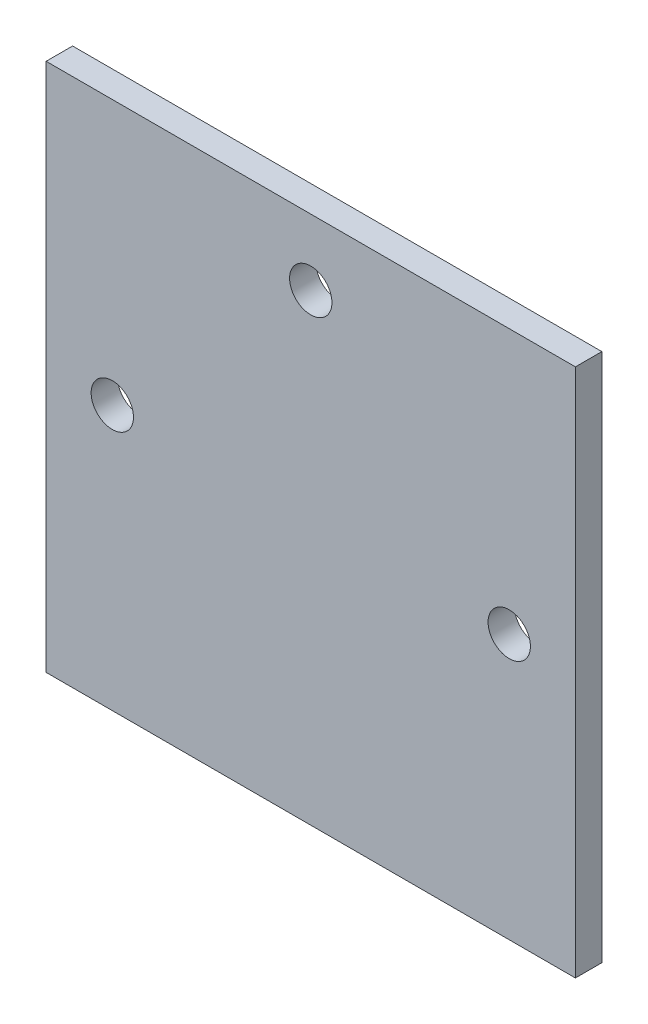
ISO-10303-21;
HEADER;
FILE_DESCRIPTION(('STEP AP214'),'2;1');
FILE_NAME('part.step','',(''),(''),'','','');
FILE_SCHEMA(('AUTOMOTIVE_DESIGN { 1 0 10303 214 1 1 1 1 }'));
ENDSEC;
DATA;
#1=APPLICATION_CONTEXT('core data for automotive mechanical design processes');
#2=APPLICATION_PROTOCOL_DEFINITION('international standard','automotive_design',2000,#1);
#3=PRODUCT_CONTEXT('',#1,'mechanical');
#4=PRODUCT('Part','Part','',(#3));
#5=PRODUCT_RELATED_PRODUCT_CATEGORY('part','',(#4));
#6=PRODUCT_DEFINITION_FORMATION('','',#4);
#7=PRODUCT_DEFINITION_CONTEXT('part definition',#1,'design');
#8=PRODUCT_DEFINITION('design','',#6,#7);
#9=PRODUCT_DEFINITION_SHAPE('','',#8);
#10=(LENGTH_UNIT() NAMED_UNIT(*) SI_UNIT(.MILLI.,.METRE.));
#11=(NAMED_UNIT(*) PLANE_ANGLE_UNIT() SI_UNIT($,.RADIAN.));
#12=(NAMED_UNIT(*) SI_UNIT($,.STERADIAN.) SOLID_ANGLE_UNIT());
#13=UNCERTAINTY_MEASURE_WITH_UNIT(LENGTH_MEASURE(1.E-05),#10,'distance_accuracy_value','');
#14=(GEOMETRIC_REPRESENTATION_CONTEXT(3) GLOBAL_UNCERTAINTY_ASSIGNED_CONTEXT((#13)) GLOBAL_UNIT_ASSIGNED_CONTEXT((#10,
#11,#12)) REPRESENTATION_CONTEXT('',''));
#15=CARTESIAN_POINT('',(0.,0.,0.));
#16=DIRECTION('',(0.,0.,1.));
#17=DIRECTION('',(1.,0.,0.));
#18=AXIS2_PLACEMENT_3D('',#15,#16,#17);
#19=CARTESIAN_POINT('',(0.,0.,-10.));
#20=DIRECTION('',(-1.,0.,0.));
#21=DIRECTION('',(0.,0.,1.));
#22=AXIS2_PLACEMENT_3D('',#19,#20,#21);
#23=PLANE('',#22);
#24=DIRECTION('',(0.,-1.,0.));
#25=VECTOR('',#24,1.);
#26=CARTESIAN_POINT('',(0.,0.,0.));
#27=LINE('',#26,#25);
#28=CARTESIAN_POINT('',(0.,0.,0.));
#29=VERTEX_POINT('',#28);
#30=CARTESIAN_POINT('',(0.,-200.,0.));
#31=VERTEX_POINT('',#30);
#32=EDGE_CURVE('E103',#29,#31,#27,.T.);
#33=ORIENTED_EDGE('',*,*,#32,.F.);
#34=DIRECTION('',(0.,0.,1.));
#35=VECTOR('',#34,1.);
#36=CARTESIAN_POINT('',(0.,0.,-10.));
#37=LINE('',#36,#35);
#38=CARTESIAN_POINT('',(0.,0.,-10.));
#39=VERTEX_POINT('',#38);
#40=EDGE_CURVE('E11',#39,#29,#37,.T.);
#41=ORIENTED_EDGE('',*,*,#40,.F.);
#42=DIRECTION('',(0.,-1.,0.));
#43=VECTOR('',#42,1.);
#44=CARTESIAN_POINT('',(0.,0.,-10.));
#45=LINE('',#44,#43);
#46=CARTESIAN_POINT('',(0.,-200.,-10.));
#47=VERTEX_POINT('',#46);
#48=EDGE_CURVE('E96',#39,#47,#45,.T.);
#49=ORIENTED_EDGE('',*,*,#48,.T.);
#50=DIRECTION('',(0.,0.,1.));
#51=VECTOR('',#50,1.);
#52=CARTESIAN_POINT('',(0.,-200.,-10.));
#53=LINE('',#52,#51);
#54=EDGE_CURVE('E41',#47,#31,#53,.T.);
#55=ORIENTED_EDGE('',*,*,#54,.T.);
#56=EDGE_LOOP('',(#33,#41,#49,#55));
#57=FACE_BOUND('',#56,.T.);
#58=ADVANCED_FACE('F38',(#57),#23,.T.);
#59=CARTESIAN_POINT('',(0.,0.,-10.));
#60=DIRECTION('',(0.,1.,0.));
#61=DIRECTION('',(-1.,0.,0.));
#62=AXIS2_PLACEMENT_3D('',#59,#60,#61);
#63=PLANE('',#62);
#64=DIRECTION('',(-1.,0.,0.));
#65=VECTOR('',#64,1.);
#66=CARTESIAN_POINT('',(0.,0.,0.));
#67=LINE('',#66,#65);
#68=CARTESIAN_POINT('',(200.,0.,0.));
#69=VERTEX_POINT('',#68);
#70=EDGE_CURVE('E98',#69,#29,#67,.T.);
#71=ORIENTED_EDGE('',*,*,#70,.F.);
#72=DIRECTION('',(0.,0.,1.));
#73=VECTOR('',#72,1.);
#74=CARTESIAN_POINT('',(200.,0.,-10.));
#75=LINE('',#74,#73);
#76=CARTESIAN_POINT('',(200.,0.,-10.));
#77=VERTEX_POINT('',#76);
#78=EDGE_CURVE('E47',#77,#69,#75,.T.);
#79=ORIENTED_EDGE('',*,*,#78,.F.);
#80=DIRECTION('',(-1.,0.,0.));
#81=VECTOR('',#80,1.);
#82=CARTESIAN_POINT('',(0.,0.,-10.));
#83=LINE('',#82,#81);
#84=EDGE_CURVE('E93',#77,#39,#83,.T.);
#85=ORIENTED_EDGE('',*,*,#84,.T.);
#86=ORIENTED_EDGE('',*,*,#40,.T.);
#87=EDGE_LOOP('',(#71,#79,#85,#86));
#88=FACE_BOUND('',#87,.T.);
#89=ADVANCED_FACE('F114',(#88),#63,.T.);
#90=CARTESIAN_POINT('',(200.,0.,-10.));
#91=DIRECTION('',(1.,0.,0.));
#92=DIRECTION('',(0.,0.,-1.));
#93=AXIS2_PLACEMENT_3D('',#90,#91,#92);
#94=PLANE('',#93);
#95=DIRECTION('',(0.,1.,0.));
#96=VECTOR('',#95,1.);
#97=CARTESIAN_POINT('',(200.,0.,0.));
#98=LINE('',#97,#96);
#99=CARTESIAN_POINT('',(200.,-200.,0.));
#100=VERTEX_POINT('',#99);
#101=EDGE_CURVE('E88',#100,#69,#98,.T.);
#102=ORIENTED_EDGE('',*,*,#101,.F.);
#103=DIRECTION('',(0.,0.,1.));
#104=VECTOR('',#103,1.);
#105=CARTESIAN_POINT('',(200.,-200.,-10.));
#106=LINE('',#105,#104);
#107=CARTESIAN_POINT('',(200.,-200.,-10.));
#108=VERTEX_POINT('',#107);
#109=EDGE_CURVE('E83',#108,#100,#106,.T.);
#110=ORIENTED_EDGE('',*,*,#109,.F.);
#111=DIRECTION('',(0.,1.,0.));
#112=VECTOR('',#111,1.);
#113=CARTESIAN_POINT('',(200.,0.,-10.));
#114=LINE('',#113,#112);
#115=EDGE_CURVE('E86',#108,#77,#114,.T.);
#116=ORIENTED_EDGE('',*,*,#115,.T.);
#117=ORIENTED_EDGE('',*,*,#78,.T.);
#118=EDGE_LOOP('',(#102,#110,#116,#117));
#119=FACE_BOUND('',#118,.T.);
#120=ADVANCED_FACE('F85',(#119),#94,.T.);
#121=CARTESIAN_POINT('',(0.,-200.,-10.));
#122=DIRECTION('',(0.,-1.,0.));
#123=DIRECTION('',(0.,0.,-1.));
#124=AXIS2_PLACEMENT_3D('',#121,#122,#123);
#125=PLANE('',#124);
#126=DIRECTION('',(1.,0.,0.));
#127=VECTOR('',#126,1.);
#128=CARTESIAN_POINT('',(0.,-200.,0.));
#129=LINE('',#128,#127);
#130=EDGE_CURVE('E106',#31,#100,#129,.T.);
#131=ORIENTED_EDGE('',*,*,#130,.F.);
#132=ORIENTED_EDGE('',*,*,#54,.F.);
#133=DIRECTION('',(1.,0.,0.));
#134=VECTOR('',#133,1.);
#135=CARTESIAN_POINT('',(0.,-200.,-10.));
#136=LINE('',#135,#134);
#137=EDGE_CURVE('E92',#47,#108,#136,.T.);
#138=ORIENTED_EDGE('',*,*,#137,.T.);
#139=ORIENTED_EDGE('',*,*,#109,.T.);
#140=EDGE_LOOP('',(#131,#132,#138,#139));
#141=FACE_BOUND('',#140,.T.);
#142=ADVANCED_FACE('F95',(#141),#125,.T.);
#143=CARTESIAN_POINT('',(0.,0.,-10.));
#144=DIRECTION('',(0.,0.,1.));
#145=DIRECTION('',(1.,0.,0.));
#146=AXIS2_PLACEMENT_3D('',#143,#144,#145);
#147=PLANE('',#146);
#148=CARTESIAN_POINT('',(175.,-100.,-10.));
#149=DIRECTION('',(0.,0.,-1.));
#150=DIRECTION('',(-1.,0.,0.));
#151=AXIS2_PLACEMENT_3D('',#148,#149,#150);
#152=CIRCLE('',#151,8.00000000000001);
#153=CARTESIAN_POINT('',(167.,-100.,-10.));
#154=VERTEX_POINT('',#153);
#155=EDGE_CURVE('E153',#154,#154,#152,.T.);
#156=ORIENTED_EDGE('',*,*,#155,.F.);
#157=EDGE_LOOP('',(#156));
#158=FACE_BOUND('',#157,.T.);
#159=CARTESIAN_POINT('',(100.,-25.,-10.));
#160=DIRECTION('',(0.,0.,-1.));
#161=DIRECTION('',(-1.,0.,0.));
#162=AXIS2_PLACEMENT_3D('',#159,#160,#161);
#163=CIRCLE('',#162,8.00000000000001);
#164=CARTESIAN_POINT('',(92.,-25.,-10.));
#165=VERTEX_POINT('',#164);
#166=EDGE_CURVE('E158',#165,#165,#163,.T.);
#167=ORIENTED_EDGE('',*,*,#166,.F.);
#168=EDGE_LOOP('',(#167));
#169=FACE_BOUND('',#168,.T.);
#170=CARTESIAN_POINT('',(25.,-100.,-10.));
#171=DIRECTION('',(0.,0.,-1.));
#172=DIRECTION('',(1.,0.,0.));
#173=AXIS2_PLACEMENT_3D('',#170,#171,#172);
#174=CIRCLE('',#173,8.);
#175=CARTESIAN_POINT('',(33.,-100.,-10.));
#176=VERTEX_POINT('',#175);
#177=EDGE_CURVE('E165',#176,#176,#174,.T.);
#178=ORIENTED_EDGE('',*,*,#177,.F.);
#179=EDGE_LOOP('',(#178));
#180=FACE_BOUND('',#179,.T.);
#181=ORIENTED_EDGE('',*,*,#48,.F.);
#182=ORIENTED_EDGE('',*,*,#84,.F.);
#183=ORIENTED_EDGE('',*,*,#115,.F.);
#184=ORIENTED_EDGE('',*,*,#137,.F.);
#185=EDGE_LOOP('',(#181,#182,#183,#184));
#186=FACE_BOUND('',#185,.T.);
#187=ADVANCED_FACE('F91',(#158,#169,#180,#186),#147,.F.);
#188=CARTESIAN_POINT('',(0.,0.,0.));
#189=DIRECTION('',(0.,0.,1.));
#190=DIRECTION('',(1.,0.,0.));
#191=AXIS2_PLACEMENT_3D('',#188,#189,#190);
#192=PLANE('',#191);
#193=CARTESIAN_POINT('',(175.,-100.,0.));
#194=DIRECTION('',(0.,0.,-1.));
#195=DIRECTION('',(-1.,0.,0.));
#196=AXIS2_PLACEMENT_3D('',#193,#194,#195);
#197=CIRCLE('',#196,8.00000000000001);
#198=CARTESIAN_POINT('',(167.,-100.,0.));
#199=VERTEX_POINT('',#198);
#200=EDGE_CURVE('E107',#199,#199,#197,.T.);
#201=ORIENTED_EDGE('',*,*,#200,.T.);
#202=EDGE_LOOP('',(#201));
#203=FACE_BOUND('',#202,.T.);
#204=CARTESIAN_POINT('',(100.,-25.,0.));
#205=DIRECTION('',(0.,0.,-1.));
#206=DIRECTION('',(-1.,0.,0.));
#207=AXIS2_PLACEMENT_3D('',#204,#205,#206);
#208=CIRCLE('',#207,8.00000000000001);
#209=CARTESIAN_POINT('',(92.,-25.,0.));
#210=VERTEX_POINT('',#209);
#211=EDGE_CURVE('E154',#210,#210,#208,.T.);
#212=ORIENTED_EDGE('',*,*,#211,.T.);
#213=EDGE_LOOP('',(#212));
#214=FACE_BOUND('',#213,.T.);
#215=CARTESIAN_POINT('',(25.,-100.,0.));
#216=DIRECTION('',(0.,0.,-1.));
#217=DIRECTION('',(1.,0.,0.));
#218=AXIS2_PLACEMENT_3D('',#215,#216,#217);
#219=CIRCLE('',#218,8.);
#220=CARTESIAN_POINT('',(33.,-100.,0.));
#221=VERTEX_POINT('',#220);
#222=EDGE_CURVE('E163',#221,#221,#219,.T.);
#223=ORIENTED_EDGE('',*,*,#222,.T.);
#224=EDGE_LOOP('',(#223));
#225=FACE_BOUND('',#224,.T.);
#226=ORIENTED_EDGE('',*,*,#32,.T.);
#227=ORIENTED_EDGE('',*,*,#130,.T.);
#228=ORIENTED_EDGE('',*,*,#101,.T.);
#229=ORIENTED_EDGE('',*,*,#70,.T.);
#230=EDGE_LOOP('',(#226,#227,#228,#229));
#231=FACE_BOUND('',#230,.T.);
#232=ADVANCED_FACE('F113',(#203,#214,#225,#231),#192,.T.);
#233=CARTESIAN_POINT('',(25.,-100.,0.));
#234=DIRECTION('',(0.,0.,-1.));
#235=DIRECTION('',(-1.,0.,0.));
#236=AXIS2_PLACEMENT_3D('',#233,#234,#235);
#237=CYLINDRICAL_SURFACE('',#236,8.);
#238=ORIENTED_EDGE('',*,*,#222,.F.);
#239=EDGE_LOOP('',(#238));
#240=FACE_BOUND('',#239,.T.);
#241=ORIENTED_EDGE('',*,*,#177,.T.);
#242=EDGE_LOOP('',(#241));
#243=FACE_BOUND('',#242,.T.);
#244=ADVANCED_FACE('F132',(#240,#243),#237,.F.);
#245=CARTESIAN_POINT('',(100.,-25.,0.));
#246=DIRECTION('',(0.,0.,-1.));
#247=DIRECTION('',(-1.,0.,0.));
#248=AXIS2_PLACEMENT_3D('',#245,#246,#247);
#249=CYLINDRICAL_SURFACE('',#248,8.00000000000001);
#250=ORIENTED_EDGE('',*,*,#211,.F.);
#251=EDGE_LOOP('',(#250));
#252=FACE_BOUND('',#251,.T.);
#253=ORIENTED_EDGE('',*,*,#166,.T.);
#254=EDGE_LOOP('',(#253));
#255=FACE_BOUND('',#254,.T.);
#256=ADVANCED_FACE('F139',(#252,#255),#249,.F.);
#257=CARTESIAN_POINT('',(175.,-100.,0.));
#258=DIRECTION('',(0.,0.,-1.));
#259=DIRECTION('',(-1.,0.,0.));
#260=AXIS2_PLACEMENT_3D('',#257,#258,#259);
#261=CYLINDRICAL_SURFACE('',#260,8.00000000000001);
#262=ORIENTED_EDGE('',*,*,#200,.F.);
#263=EDGE_LOOP('',(#262));
#264=FACE_BOUND('',#263,.T.);
#265=ORIENTED_EDGE('',*,*,#155,.T.);
#266=EDGE_LOOP('',(#265));
#267=FACE_BOUND('',#266,.T.);
#268=ADVANCED_FACE('F143',(#264,#267),#261,.F.);
#269=CLOSED_SHELL('',(#58,#89,#120,#142,#187,#232,#244,#256,#268));
#270=MANIFOLD_SOLID_BREP('B2',#269);
#271=ADVANCED_BREP_SHAPE_REPRESENTATION('',(#18,#270),#14);
#272=SHAPE_DEFINITION_REPRESENTATION(#9,#271);
ENDSEC;
END-ISO-10303-21;
